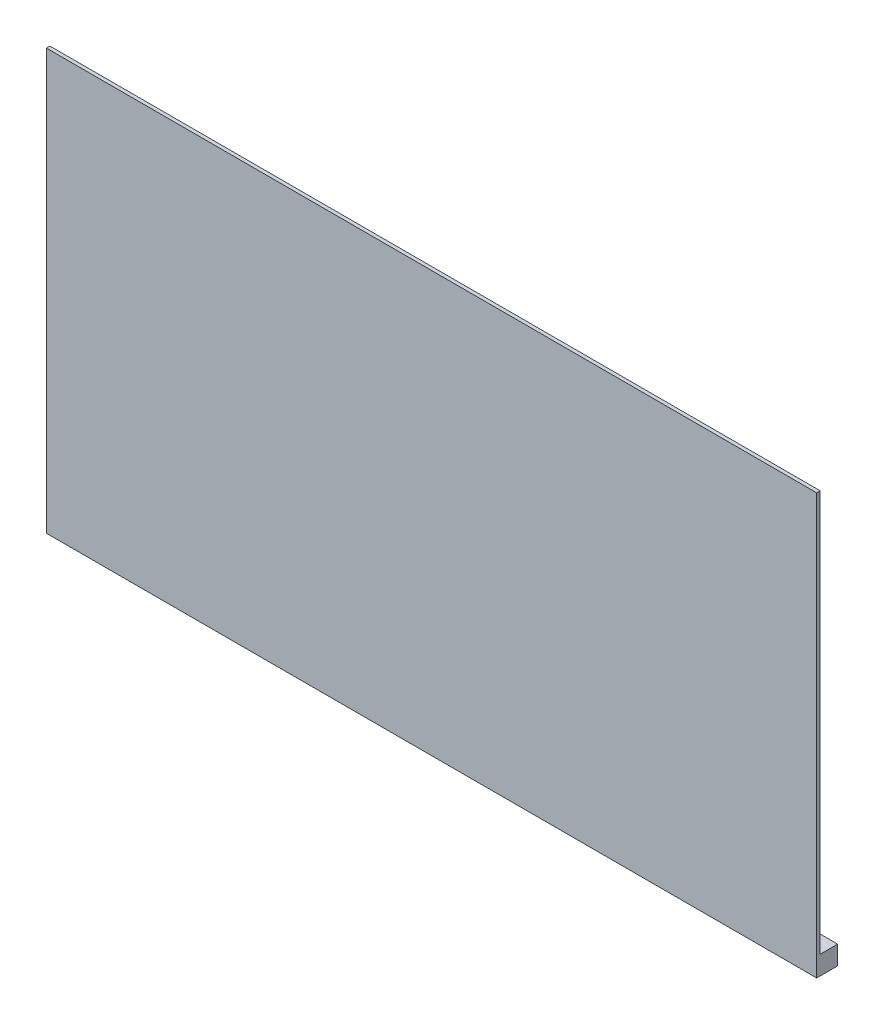
ISO-10303-21;
HEADER;
FILE_DESCRIPTION(('STEP AP214'),'2;1');
FILE_NAME('part.step','',(''),(''),'','','');
FILE_SCHEMA(('AUTOMOTIVE_DESIGN { 1 0 10303 214 1 1 1 1 }'));
ENDSEC;
DATA;
#1=APPLICATION_CONTEXT('core data for automotive mechanical design processes');
#2=APPLICATION_PROTOCOL_DEFINITION('international standard','automotive_design',2000,#1);
#3=PRODUCT_CONTEXT('',#1,'mechanical');
#4=PRODUCT('Part','Part','',(#3));
#5=PRODUCT_RELATED_PRODUCT_CATEGORY('part','',(#4));
#6=PRODUCT_DEFINITION_FORMATION('','',#4);
#7=PRODUCT_DEFINITION_CONTEXT('part definition',#1,'design');
#8=PRODUCT_DEFINITION('design','',#6,#7);
#9=PRODUCT_DEFINITION_SHAPE('','',#8);
#10=(LENGTH_UNIT() NAMED_UNIT(*) SI_UNIT(.MILLI.,.METRE.));
#11=(NAMED_UNIT(*) PLANE_ANGLE_UNIT() SI_UNIT($,.RADIAN.));
#12=(NAMED_UNIT(*) SI_UNIT($,.STERADIAN.) SOLID_ANGLE_UNIT());
#13=UNCERTAINTY_MEASURE_WITH_UNIT(LENGTH_MEASURE(1.E-05),#10,'distance_accuracy_value','');
#14=(GEOMETRIC_REPRESENTATION_CONTEXT(3) GLOBAL_UNCERTAINTY_ASSIGNED_CONTEXT((#13)) GLOBAL_UNIT_ASSIGNED_CONTEXT((#10,
#11,#12)) REPRESENTATION_CONTEXT('',''));
#15=CARTESIAN_POINT('',(0.,0.,0.));
#16=DIRECTION('',(0.,0.,1.));
#17=DIRECTION('',(1.,0.,0.));
#18=AXIS2_PLACEMENT_3D('',#15,#16,#17);
#19=CARTESIAN_POINT('',(0.,0.,-10.));
#20=DIRECTION('',(0.,0.,1.));
#21=DIRECTION('',(1.,0.,0.));
#22=AXIS2_PLACEMENT_3D('',#19,#20,#21);
#23=PLANE('',#22);
#24=DIRECTION('',(1.,0.,0.));
#25=VECTOR('',#24,1.);
#26=CARTESIAN_POINT('',(4400.,-8892.33193887716,-10.));
#27=LINE('',#26,#25);
#28=CARTESIAN_POINT('',(4400.,-8892.33193887716,-10.));
#29=VERTEX_POINT('',#28);
#30=CARTESIAN_POINT('',(8800.,-8892.33193887716,-10.));
#31=VERTEX_POINT('',#30);
#32=EDGE_CURVE('E58',#29,#31,#27,.T.);
#33=ORIENTED_EDGE('',*,*,#32,.F.);
#34=DIRECTION('',(0.,-1.,0.));
#35=VECTOR('',#34,1.);
#36=CARTESIAN_POINT('',(4400.,-6600.,-10.));
#37=LINE('',#36,#35);
#38=CARTESIAN_POINT('',(4400.,-6600.,-10.));
#39=VERTEX_POINT('',#38);
#40=EDGE_CURVE('E122',#39,#29,#37,.T.);
#41=ORIENTED_EDGE('',*,*,#40,.F.);
#42=DIRECTION('',(1.,0.,0.));
#43=VECTOR('',#42,1.);
#44=CARTESIAN_POINT('',(4400.,-6600.,-10.));
#45=LINE('',#44,#43);
#46=CARTESIAN_POINT('',(8800.,-6600.,-10.));
#47=VERTEX_POINT('',#46);
#48=EDGE_CURVE('E131',#39,#47,#45,.T.);
#49=ORIENTED_EDGE('',*,*,#48,.T.);
#50=DIRECTION('',(0.,-1.,0.));
#51=VECTOR('',#50,1.);
#52=CARTESIAN_POINT('',(8800.,-6600.,-10.));
#53=LINE('',#52,#51);
#54=EDGE_CURVE('E124',#47,#31,#53,.T.);
#55=ORIENTED_EDGE('',*,*,#54,.T.);
#56=EDGE_LOOP('',(#33,#41,#49,#55));
#57=FACE_BOUND('',#56,.T.);
#58=ADVANCED_FACE('F43',(#57),#23,.F.);
#59=CARTESIAN_POINT('',(4400.,-6600.,10.));
#60=DIRECTION('',(1.,0.,0.));
#61=DIRECTION('',(0.,0.,-1.));
#62=AXIS2_PLACEMENT_3D('',#59,#60,#61);
#63=PLANE('',#62);
#64=ORIENTED_EDGE('',*,*,#40,.T.);
#65=DIRECTION('',(0.,0.,1.));
#66=VECTOR('',#65,1.);
#67=CARTESIAN_POINT('',(4400.,-8892.33193887716,-110.));
#68=LINE('',#67,#66);
#69=CARTESIAN_POINT('',(4400.,-8892.33193887716,-110.));
#70=VERTEX_POINT('',#69);
#71=EDGE_CURVE('E106',#70,#29,#68,.T.);
#72=ORIENTED_EDGE('',*,*,#71,.F.);
#73=DIRECTION('',(0.,1.,0.));
#74=VECTOR('',#73,1.);
#75=CARTESIAN_POINT('',(4400.,-9000.,-110.));
#76=LINE('',#75,#74);
#77=CARTESIAN_POINT('',(4400.,-9000.,-110.));
#78=VERTEX_POINT('',#77);
#79=EDGE_CURVE('E113',#78,#70,#76,.T.);
#80=ORIENTED_EDGE('',*,*,#79,.F.);
#81=DIRECTION('',(0.,0.,-1.));
#82=VECTOR('',#81,1.);
#83=CARTESIAN_POINT('',(4400.,-9000.,10.));
#84=LINE('',#83,#82);
#85=CARTESIAN_POINT('',(4400.,-9000.,10.));
#86=VERTEX_POINT('',#85);
#87=EDGE_CURVE('E11',#86,#78,#84,.T.);
#88=ORIENTED_EDGE('',*,*,#87,.F.);
#89=DIRECTION('',(0.,-1.,0.));
#90=VECTOR('',#89,1.);
#91=CARTESIAN_POINT('',(4400.,-6600.,10.));
#92=LINE('',#91,#90);
#93=CARTESIAN_POINT('',(4400.,-6600.,10.));
#94=VERTEX_POINT('',#93);
#95=EDGE_CURVE('E129',#94,#86,#92,.T.);
#96=ORIENTED_EDGE('',*,*,#95,.F.);
#97=DIRECTION('',(0.,0.,-1.));
#98=VECTOR('',#97,1.);
#99=CARTESIAN_POINT('',(4400.,-6600.,10.));
#100=LINE('',#99,#98);
#101=EDGE_CURVE('E67',#94,#39,#100,.T.);
#102=ORIENTED_EDGE('',*,*,#101,.T.);
#103=EDGE_LOOP('',(#64,#72,#80,#88,#96,#102));
#104=FACE_BOUND('',#103,.T.);
#105=ADVANCED_FACE('F45',(#104),#63,.F.);
#106=CARTESIAN_POINT('',(4400.,-9000.,10.));
#107=DIRECTION('',(0.,1.,0.));
#108=DIRECTION('',(0.,0.,1.));
#109=AXIS2_PLACEMENT_3D('',#106,#107,#108);
#110=PLANE('',#109);
#111=ORIENTED_EDGE('',*,*,#87,.T.);
#112=DIRECTION('',(-1.,0.,0.));
#113=VECTOR('',#112,1.);
#114=CARTESIAN_POINT('',(4400.,-9000.,-110.));
#115=LINE('',#114,#113);
#116=CARTESIAN_POINT('',(8800.,-9000.,-110.));
#117=VERTEX_POINT('',#116);
#118=EDGE_CURVE('E119',#117,#78,#115,.T.);
#119=ORIENTED_EDGE('',*,*,#118,.F.);
#120=DIRECTION('',(0.,0.,-1.));
#121=VECTOR('',#120,1.);
#122=CARTESIAN_POINT('',(8800.,-9000.,10.));
#123=LINE('',#122,#121);
#124=CARTESIAN_POINT('',(8800.,-9000.,10.));
#125=VERTEX_POINT('',#124);
#126=EDGE_CURVE('E51',#125,#117,#123,.T.);
#127=ORIENTED_EDGE('',*,*,#126,.F.);
#128=DIRECTION('',(1.,0.,0.));
#129=VECTOR('',#128,1.);
#130=CARTESIAN_POINT('',(4400.,-9000.,10.));
#131=LINE('',#130,#129);
#132=EDGE_CURVE('E85',#86,#125,#131,.T.);
#133=ORIENTED_EDGE('',*,*,#132,.F.);
#134=EDGE_LOOP('',(#111,#119,#127,#133));
#135=FACE_BOUND('',#134,.T.);
#136=ADVANCED_FACE('F148',(#135),#110,.F.);
#137=CARTESIAN_POINT('',(8800.,-6600.,10.));
#138=DIRECTION('',(1.,0.,0.));
#139=DIRECTION('',(0.,0.,-1.));
#140=AXIS2_PLACEMENT_3D('',#137,#138,#139);
#141=PLANE('',#140);
#142=ORIENTED_EDGE('',*,*,#54,.F.);
#143=DIRECTION('',(0.,0.,-1.));
#144=VECTOR('',#143,1.);
#145=CARTESIAN_POINT('',(8800.,-6600.,10.));
#146=LINE('',#145,#144);
#147=CARTESIAN_POINT('',(8800.,-6600.,10.));
#148=VERTEX_POINT('',#147);
#149=EDGE_CURVE('E142',#148,#47,#146,.T.);
#150=ORIENTED_EDGE('',*,*,#149,.F.);
#151=DIRECTION('',(0.,-1.,0.));
#152=VECTOR('',#151,1.);
#153=CARTESIAN_POINT('',(8800.,-6600.,10.));
#154=LINE('',#153,#152);
#155=EDGE_CURVE('E133',#148,#125,#154,.T.);
#156=ORIENTED_EDGE('',*,*,#155,.T.);
#157=ORIENTED_EDGE('',*,*,#126,.T.);
#158=DIRECTION('',(0.,-1.,0.));
#159=VECTOR('',#158,1.);
#160=CARTESIAN_POINT('',(8800.,-9000.,-110.));
#161=LINE('',#160,#159);
#162=CARTESIAN_POINT('',(8800.,-8892.33193887716,-110.));
#163=VERTEX_POINT('',#162);
#164=EDGE_CURVE('E112',#163,#117,#161,.T.);
#165=ORIENTED_EDGE('',*,*,#164,.F.);
#166=DIRECTION('',(0.,0.,1.));
#167=VECTOR('',#166,1.);
#168=CARTESIAN_POINT('',(8800.,-8892.33193887716,-110.));
#169=LINE('',#168,#167);
#170=EDGE_CURVE('E108',#163,#31,#169,.T.);
#171=ORIENTED_EDGE('',*,*,#170,.T.);
#172=EDGE_LOOP('',(#142,#150,#156,#157,#165,#171));
#173=FACE_BOUND('',#172,.T.);
#174=ADVANCED_FACE('F145',(#173),#141,.T.);
#175=CARTESIAN_POINT('',(4400.,-6600.,10.));
#176=DIRECTION('',(0.,1.,0.));
#177=DIRECTION('',(0.,0.,1.));
#178=AXIS2_PLACEMENT_3D('',#175,#176,#177);
#179=PLANE('',#178);
#180=ORIENTED_EDGE('',*,*,#48,.F.);
#181=ORIENTED_EDGE('',*,*,#101,.F.);
#182=DIRECTION('',(1.,0.,0.));
#183=VECTOR('',#182,1.);
#184=CARTESIAN_POINT('',(4400.,-6600.,10.));
#185=LINE('',#184,#183);
#186=EDGE_CURVE('E136',#94,#148,#185,.T.);
#187=ORIENTED_EDGE('',*,*,#186,.T.);
#188=ORIENTED_EDGE('',*,*,#149,.T.);
#189=EDGE_LOOP('',(#180,#181,#187,#188));
#190=FACE_BOUND('',#189,.T.);
#191=ADVANCED_FACE('F150',(#190),#179,.T.);
#192=CARTESIAN_POINT('',(0.,0.,10.));
#193=DIRECTION('',(0.,0.,1.));
#194=DIRECTION('',(1.,0.,0.));
#195=AXIS2_PLACEMENT_3D('',#192,#193,#194);
#196=PLANE('',#195);
#197=ORIENTED_EDGE('',*,*,#95,.T.);
#198=ORIENTED_EDGE('',*,*,#132,.T.);
#199=ORIENTED_EDGE('',*,*,#155,.F.);
#200=ORIENTED_EDGE('',*,*,#186,.F.);
#201=EDGE_LOOP('',(#197,#198,#199,#200));
#202=FACE_BOUND('',#201,.T.);
#203=ADVANCED_FACE('F153',(#202),#196,.T.);
#204=CARTESIAN_POINT('',(4400.,-8892.33193887716,-110.));
#205=DIRECTION('',(0.,-1.,0.));
#206=DIRECTION('',(1.,0.,0.));
#207=AXIS2_PLACEMENT_3D('',#204,#205,#206);
#208=PLANE('',#207);
#209=ORIENTED_EDGE('',*,*,#32,.T.);
#210=ORIENTED_EDGE('',*,*,#170,.F.);
#211=DIRECTION('',(1.,0.,0.));
#212=VECTOR('',#211,1.);
#213=CARTESIAN_POINT('',(4400.,-8892.33193887716,-110.));
#214=LINE('',#213,#212);
#215=EDGE_CURVE('E102',#70,#163,#214,.T.);
#216=ORIENTED_EDGE('',*,*,#215,.F.);
#217=ORIENTED_EDGE('',*,*,#71,.T.);
#218=EDGE_LOOP('',(#209,#210,#216,#217));
#219=FACE_BOUND('',#218,.T.);
#220=ADVANCED_FACE('F104',(#219),#208,.F.);
#221=CARTESIAN_POINT('',(0.,0.,-110.));
#222=DIRECTION('',(0.,0.,-1.));
#223=DIRECTION('',(-1.,0.,0.));
#224=AXIS2_PLACEMENT_3D('',#221,#222,#223);
#225=PLANE('',#224);
#226=ORIENTED_EDGE('',*,*,#79,.T.);
#227=ORIENTED_EDGE('',*,*,#215,.T.);
#228=ORIENTED_EDGE('',*,*,#164,.T.);
#229=ORIENTED_EDGE('',*,*,#118,.T.);
#230=EDGE_LOOP('',(#226,#227,#228,#229));
#231=FACE_BOUND('',#230,.T.);
#232=ADVANCED_FACE('F117',(#231),#225,.T.);
#233=CLOSED_SHELL('',(#58,#105,#136,#174,#191,#203,#220,#232));
#234=MANIFOLD_SOLID_BREP('B2',#233);
#235=ADVANCED_BREP_SHAPE_REPRESENTATION('',(#18,#234),#14);
#236=SHAPE_DEFINITION_REPRESENTATION(#9,#235);
ENDSEC;
END-ISO-10303-21;
